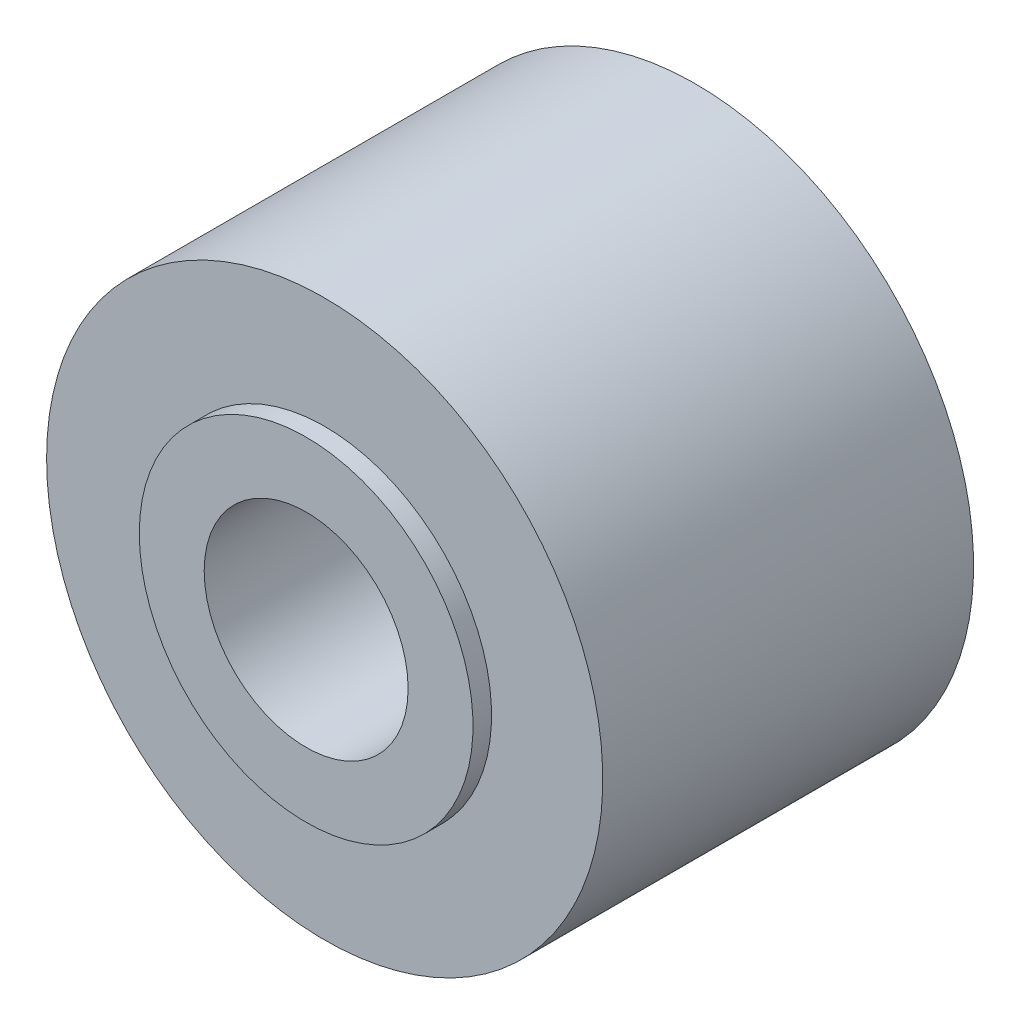
ISO-10303-21;
HEADER;
FILE_DESCRIPTION(('STEP AP214'),'2;1');
FILE_NAME('part.step','',(''),(''),'','','');
FILE_SCHEMA(('AUTOMOTIVE_DESIGN { 1 0 10303 214 1 1 1 1 }'));
ENDSEC;
DATA;
#1=APPLICATION_CONTEXT('core data for automotive mechanical design processes');
#2=APPLICATION_PROTOCOL_DEFINITION('international standard','automotive_design',2000,#1);
#3=PRODUCT_CONTEXT('',#1,'mechanical');
#4=PRODUCT('Part','Part','',(#3));
#5=PRODUCT_RELATED_PRODUCT_CATEGORY('part','',(#4));
#6=PRODUCT_DEFINITION_FORMATION('','',#4);
#7=PRODUCT_DEFINITION_CONTEXT('part definition',#1,'design');
#8=PRODUCT_DEFINITION('design','',#6,#7);
#9=PRODUCT_DEFINITION_SHAPE('','',#8);
#10=(LENGTH_UNIT() NAMED_UNIT(*) SI_UNIT(.MILLI.,.METRE.));
#11=(NAMED_UNIT(*) PLANE_ANGLE_UNIT() SI_UNIT($,.RADIAN.));
#12=(NAMED_UNIT(*) SI_UNIT($,.STERADIAN.) SOLID_ANGLE_UNIT());
#13=UNCERTAINTY_MEASURE_WITH_UNIT(LENGTH_MEASURE(1.E-05),#10,'distance_accuracy_value','');
#14=(GEOMETRIC_REPRESENTATION_CONTEXT(3) GLOBAL_UNCERTAINTY_ASSIGNED_CONTEXT((#13)) GLOBAL_UNIT_ASSIGNED_CONTEXT((#10,
#11,#12)) REPRESENTATION_CONTEXT('',''));
#15=CARTESIAN_POINT('',(0.,0.,0.));
#16=DIRECTION('',(0.,0.,1.));
#17=DIRECTION('',(1.,0.,0.));
#18=AXIS2_PLACEMENT_3D('',#15,#16,#17);
#19=CARTESIAN_POINT('',(0.,0.,-74.7868623467422));
#20=DIRECTION('',(0.,0.,-1.));
#21=DIRECTION('',(-1.,0.,0.));
#22=AXIS2_PLACEMENT_3D('',#19,#20,#21);
#23=CYLINDRICAL_SURFACE('',#22,11.);
#24=CARTESIAN_POINT('',(0.,0.,42.));
#25=DIRECTION('',(0.,0.,-1.));
#26=DIRECTION('',(-1.,0.,0.));
#27=AXIS2_PLACEMENT_3D('',#24,#25,#26);
#28=CIRCLE('',#27,11.);
#29=CARTESIAN_POINT('',(-11.,0.,42.));
#30=VERTEX_POINT('',#29);
#31=EDGE_CURVE('E61',#30,#30,#28,.T.);
#32=ORIENTED_EDGE('',*,*,#31,.F.);
#33=EDGE_LOOP('',(#32));
#34=FACE_BOUND('',#33,.T.);
#35=CARTESIAN_POINT('',(0.,0.,0.));
#36=DIRECTION('',(0.,0.,-1.));
#37=DIRECTION('',(-1.,0.,0.));
#38=AXIS2_PLACEMENT_3D('',#35,#36,#37);
#39=CIRCLE('',#38,11.);
#40=CARTESIAN_POINT('',(-11.,0.,0.));
#41=VERTEX_POINT('',#40);
#42=EDGE_CURVE('E10',#41,#41,#39,.T.);
#43=ORIENTED_EDGE('',*,*,#42,.T.);
#44=EDGE_LOOP('',(#43));
#45=FACE_BOUND('',#44,.T.);
#46=ADVANCED_FACE('F39',(#34,#45),#23,.F.);
#47=CARTESIAN_POINT('',(0.,-11.,0.));
#48=DIRECTION('',(0.,0.,1.));
#49=DIRECTION('',(1.,0.,0.));
#50=AXIS2_PLACEMENT_3D('',#47,#48,#49);
#51=PLANE('',#50);
#52=ORIENTED_EDGE('',*,*,#42,.F.);
#53=EDGE_LOOP('',(#52));
#54=FACE_BOUND('',#53,.T.);
#55=CARTESIAN_POINT('',(0.,0.,0.));
#56=DIRECTION('',(0.,0.,-1.));
#57=DIRECTION('',(-1.,0.,0.));
#58=AXIS2_PLACEMENT_3D('',#55,#56,#57);
#59=CIRCLE('',#58,30.);
#60=CARTESIAN_POINT('',(-30.,0.,0.));
#61=VERTEX_POINT('',#60);
#62=EDGE_CURVE('E45',#61,#61,#59,.T.);
#63=ORIENTED_EDGE('',*,*,#62,.T.);
#64=EDGE_LOOP('',(#63));
#65=FACE_BOUND('',#64,.T.);
#66=ADVANCED_FACE('F68',(#54,#65),#51,.F.);
#67=CARTESIAN_POINT('',(0.,0.,-74.7868623467422));
#68=DIRECTION('',(0.,0.,-1.));
#69=DIRECTION('',(-1.,0.,0.));
#70=AXIS2_PLACEMENT_3D('',#67,#68,#69);
#71=CYLINDRICAL_SURFACE('',#70,30.);
#72=ORIENTED_EDGE('',*,*,#62,.F.);
#73=EDGE_LOOP('',(#72));
#74=FACE_BOUND('',#73,.T.);
#75=CARTESIAN_POINT('',(0.,0.,40.));
#76=DIRECTION('',(0.,0.,-1.));
#77=DIRECTION('',(-1.,0.,0.));
#78=AXIS2_PLACEMENT_3D('',#75,#76,#77);
#79=CIRCLE('',#78,30.);
#80=CARTESIAN_POINT('',(-30.,0.,40.));
#81=VERTEX_POINT('',#80);
#82=EDGE_CURVE('E49',#81,#81,#79,.T.);
#83=ORIENTED_EDGE('',*,*,#82,.T.);
#84=EDGE_LOOP('',(#83));
#85=FACE_BOUND('',#84,.T.);
#86=ADVANCED_FACE('F72',(#74,#85),#71,.T.);
#87=CARTESIAN_POINT('',(0.,-30.,40.));
#88=DIRECTION('',(0.,0.,-1.));
#89=DIRECTION('',(-1.,0.,0.));
#90=AXIS2_PLACEMENT_3D('',#87,#88,#89);
#91=PLANE('',#90);
#92=ORIENTED_EDGE('',*,*,#82,.F.);
#93=EDGE_LOOP('',(#92));
#94=FACE_BOUND('',#93,.T.);
#95=CARTESIAN_POINT('',(0.,0.,40.));
#96=DIRECTION('',(0.,0.,-1.));
#97=DIRECTION('',(-1.,0.,0.));
#98=AXIS2_PLACEMENT_3D('',#95,#96,#97);
#99=CIRCLE('',#98,18.);
#100=CARTESIAN_POINT('',(-18.,0.,40.));
#101=VERTEX_POINT('',#100);
#102=EDGE_CURVE('E53',#101,#101,#99,.T.);
#103=ORIENTED_EDGE('',*,*,#102,.T.);
#104=EDGE_LOOP('',(#103));
#105=FACE_BOUND('',#104,.T.);
#106=ADVANCED_FACE('F77',(#94,#105),#91,.F.);
#107=CARTESIAN_POINT('',(0.,0.,-74.7868623467422));
#108=DIRECTION('',(0.,0.,-1.));
#109=DIRECTION('',(-1.,0.,0.));
#110=AXIS2_PLACEMENT_3D('',#107,#108,#109);
#111=CYLINDRICAL_SURFACE('',#110,18.);
#112=ORIENTED_EDGE('',*,*,#102,.F.);
#113=EDGE_LOOP('',(#112));
#114=FACE_BOUND('',#113,.T.);
#115=CARTESIAN_POINT('',(0.,0.,42.));
#116=DIRECTION('',(0.,0.,-1.));
#117=DIRECTION('',(-1.,0.,0.));
#118=AXIS2_PLACEMENT_3D('',#115,#116,#117);
#119=CIRCLE('',#118,18.);
#120=CARTESIAN_POINT('',(-18.,0.,42.));
#121=VERTEX_POINT('',#120);
#122=EDGE_CURVE('E58',#121,#121,#119,.T.);
#123=ORIENTED_EDGE('',*,*,#122,.T.);
#124=EDGE_LOOP('',(#123));
#125=FACE_BOUND('',#124,.T.);
#126=ADVANCED_FACE('F83',(#114,#125),#111,.T.);
#127=CARTESIAN_POINT('',(0.,-18.,42.));
#128=DIRECTION('',(0.,0.,-1.));
#129=DIRECTION('',(-1.,0.,0.));
#130=AXIS2_PLACEMENT_3D('',#127,#128,#129);
#131=PLANE('',#130);
#132=ORIENTED_EDGE('',*,*,#122,.F.);
#133=EDGE_LOOP('',(#132));
#134=FACE_BOUND('',#133,.T.);
#135=ORIENTED_EDGE('',*,*,#31,.T.);
#136=EDGE_LOOP('',(#135));
#137=FACE_BOUND('',#136,.T.);
#138=ADVANCED_FACE('F65',(#134,#137),#131,.F.);
#139=CLOSED_SHELL('',(#46,#66,#86,#106,#126,#138));
#140=MANIFOLD_SOLID_BREP('B2',#139);
#141=ADVANCED_BREP_SHAPE_REPRESENTATION('',(#18,#140),#14);
#142=SHAPE_DEFINITION_REPRESENTATION(#9,#141);
ENDSEC;
END-ISO-10303-21;
